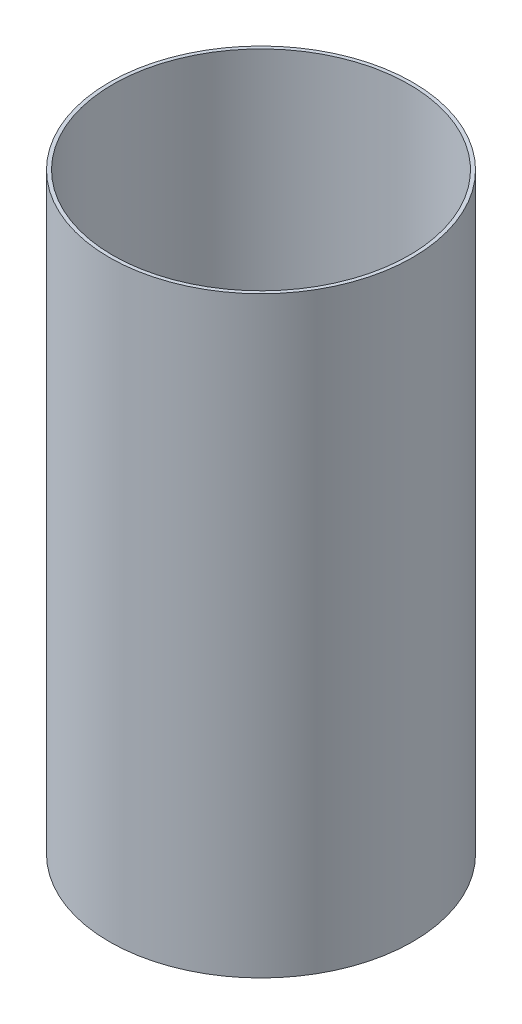
ISO-10303-21;
HEADER;
FILE_DESCRIPTION(('STEP AP214'),'2;1');
FILE_NAME('part.step','',(''),(''),'','','');
FILE_SCHEMA(('AUTOMOTIVE_DESIGN { 1 0 10303 214 1 1 1 1 }'));
ENDSEC;
DATA;
#1=APPLICATION_CONTEXT('core data for automotive mechanical design processes');
#2=APPLICATION_PROTOCOL_DEFINITION('international standard','automotive_design',2000,#1);
#3=PRODUCT_CONTEXT('',#1,'mechanical');
#4=PRODUCT('Part','Part','',(#3));
#5=PRODUCT_RELATED_PRODUCT_CATEGORY('part','',(#4));
#6=PRODUCT_DEFINITION_FORMATION('','',#4);
#7=PRODUCT_DEFINITION_CONTEXT('part definition',#1,'design');
#8=PRODUCT_DEFINITION('design','',#6,#7);
#9=PRODUCT_DEFINITION_SHAPE('','',#8);
#10=(LENGTH_UNIT() NAMED_UNIT(*) SI_UNIT(.MILLI.,.METRE.));
#11=(NAMED_UNIT(*) PLANE_ANGLE_UNIT() SI_UNIT($,.RADIAN.));
#12=(NAMED_UNIT(*) SI_UNIT($,.STERADIAN.) SOLID_ANGLE_UNIT());
#13=UNCERTAINTY_MEASURE_WITH_UNIT(LENGTH_MEASURE(1.E-05),#10,'distance_accuracy_value','');
#14=(GEOMETRIC_REPRESENTATION_CONTEXT(3) GLOBAL_UNCERTAINTY_ASSIGNED_CONTEXT((#13)) GLOBAL_UNIT_ASSIGNED_CONTEXT((#10,
#11,#12)) REPRESENTATION_CONTEXT('',''));
#15=CARTESIAN_POINT('',(0.,0.,0.));
#16=DIRECTION('',(0.,0.,1.));
#17=DIRECTION('',(1.,0.,0.));
#18=AXIS2_PLACEMENT_3D('',#15,#16,#17);
#19=CARTESIAN_POINT('',(0.,500.,0.));
#20=DIRECTION('',(0.,1.,0.));
#21=DIRECTION('',(0.,0.,1.));
#22=AXIS2_PLACEMENT_3D('',#19,#20,#21);
#23=PLANE('',#22);
#24=CARTESIAN_POINT('',(0.,500.,0.));
#25=DIRECTION('',(0.,1.,0.));
#26=DIRECTION('',(0.,0.,1.));
#27=AXIS2_PLACEMENT_3D('',#24,#25,#26);
#28=CIRCLE('',#27,128.);
#29=CARTESIAN_POINT('',(0.,500.,128.));
#30=VERTEX_POINT('',#29);
#31=EDGE_CURVE('E10',#30,#30,#28,.T.);
#32=ORIENTED_EDGE('',*,*,#31,.T.);
#33=EDGE_LOOP('',(#32));
#34=FACE_BOUND('',#33,.T.);
#35=CARTESIAN_POINT('',(0.,500.,0.));
#36=DIRECTION('',(0.,1.,0.));
#37=DIRECTION('',(0.,0.,1.));
#38=AXIS2_PLACEMENT_3D('',#35,#36,#37);
#39=CIRCLE('',#38,125.);
#40=CARTESIAN_POINT('',(0.,500.,125.));
#41=VERTEX_POINT('',#40);
#42=EDGE_CURVE('E50',#41,#41,#39,.T.);
#43=ORIENTED_EDGE('',*,*,#42,.F.);
#44=EDGE_LOOP('',(#43));
#45=FACE_BOUND('',#44,.T.);
#46=ADVANCED_FACE('F39',(#34,#45),#23,.T.);
#47=CARTESIAN_POINT('',(0.,0.,0.));
#48=DIRECTION('',(0.,1.,0.));
#49=DIRECTION('',(0.,0.,1.));
#50=AXIS2_PLACEMENT_3D('',#47,#48,#49);
#51=PLANE('',#50);
#52=CARTESIAN_POINT('',(0.,0.,0.));
#53=DIRECTION('',(0.,1.,0.));
#54=DIRECTION('',(0.,0.,1.));
#55=AXIS2_PLACEMENT_3D('',#52,#53,#54);
#56=CIRCLE('',#55,128.);
#57=CARTESIAN_POINT('',(0.,0.,128.));
#58=VERTEX_POINT('',#57);
#59=EDGE_CURVE('E43',#58,#58,#56,.T.);
#60=ORIENTED_EDGE('',*,*,#59,.F.);
#61=EDGE_LOOP('',(#60));
#62=FACE_BOUND('',#61,.T.);
#63=CARTESIAN_POINT('',(0.,0.,0.));
#64=DIRECTION('',(0.,1.,0.));
#65=DIRECTION('',(0.,0.,1.));
#66=AXIS2_PLACEMENT_3D('',#63,#64,#65);
#67=CIRCLE('',#66,125.);
#68=CARTESIAN_POINT('',(0.,0.,125.));
#69=VERTEX_POINT('',#68);
#70=EDGE_CURVE('E52',#69,#69,#67,.T.);
#71=ORIENTED_EDGE('',*,*,#70,.T.);
#72=EDGE_LOOP('',(#71));
#73=FACE_BOUND('',#72,.T.);
#74=ADVANCED_FACE('F62',(#62,#73),#51,.F.);
#75=CARTESIAN_POINT('',(0.,500.,0.));
#76=DIRECTION('',(0.,-1.,0.));
#77=DIRECTION('',(0.,0.,-1.));
#78=AXIS2_PLACEMENT_3D('',#75,#76,#77);
#79=CYLINDRICAL_SURFACE('',#78,128.);
#80=ORIENTED_EDGE('',*,*,#31,.F.);
#81=EDGE_LOOP('',(#80));
#82=FACE_BOUND('',#81,.T.);
#83=ORIENTED_EDGE('',*,*,#59,.T.);
#84=EDGE_LOOP('',(#83));
#85=FACE_BOUND('',#84,.T.);
#86=ADVANCED_FACE('F41',(#82,#85),#79,.T.);
#87=CARTESIAN_POINT('',(0.,500.,0.));
#88=DIRECTION('',(0.,-1.,0.));
#89=DIRECTION('',(0.,0.,-1.));
#90=AXIS2_PLACEMENT_3D('',#87,#88,#89);
#91=CYLINDRICAL_SURFACE('',#90,125.);
#92=ORIENTED_EDGE('',*,*,#42,.T.);
#93=EDGE_LOOP('',(#92));
#94=FACE_BOUND('',#93,.T.);
#95=ORIENTED_EDGE('',*,*,#70,.F.);
#96=EDGE_LOOP('',(#95));
#97=FACE_BOUND('',#96,.T.);
#98=ADVANCED_FACE('F58',(#94,#97),#91,.F.);
#99=CLOSED_SHELL('',(#46,#74,#86,#98));
#100=MANIFOLD_SOLID_BREP('B2',#99);
#101=ADVANCED_BREP_SHAPE_REPRESENTATION('',(#18,#100),#14);
#102=SHAPE_DEFINITION_REPRESENTATION(#9,#101);
ENDSEC;
END-ISO-10303-21;
